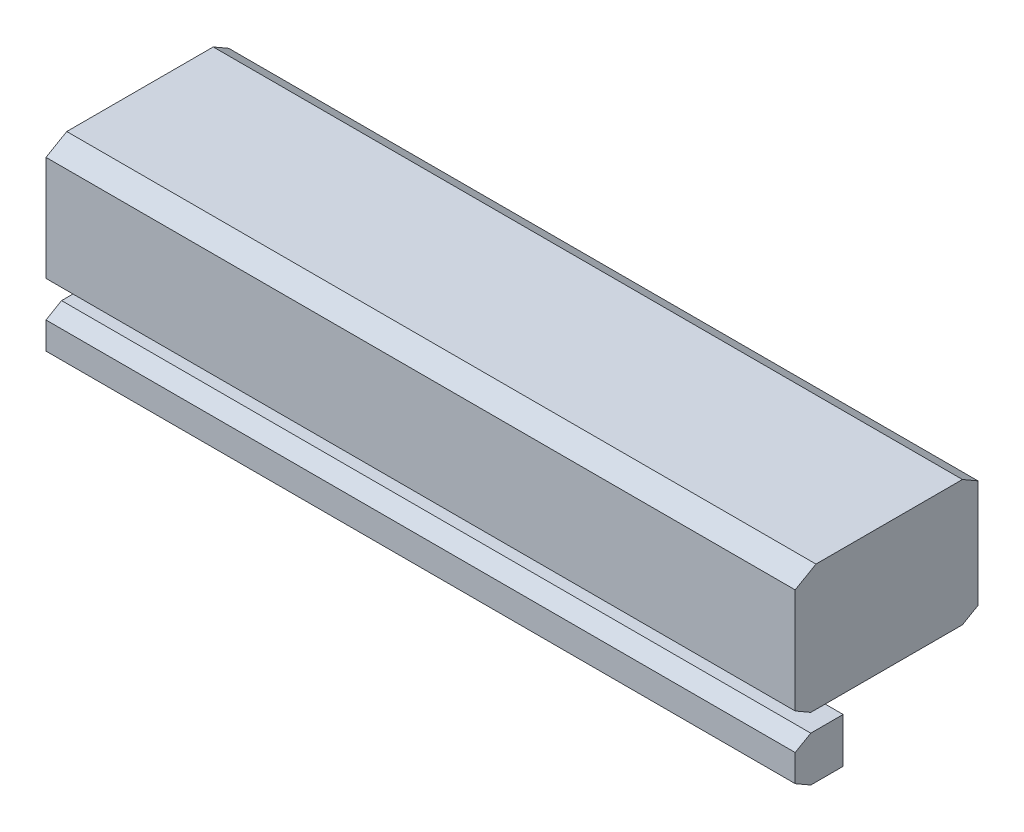
ISO-10303-21;
HEADER;
FILE_DESCRIPTION(('STEP AP214'),'2;1');
FILE_NAME('part.step','',(''),(''),'','','');
FILE_SCHEMA(('AUTOMOTIVE_DESIGN { 1 0 10303 214 1 1 1 1 }'));
ENDSEC;
DATA;
#1=APPLICATION_CONTEXT('core data for automotive mechanical design processes');
#2=APPLICATION_PROTOCOL_DEFINITION('international standard','automotive_design',2000,#1);
#3=PRODUCT_CONTEXT('',#1,'mechanical');
#4=PRODUCT('Part','Part','',(#3));
#5=PRODUCT_RELATED_PRODUCT_CATEGORY('part','',(#4));
#6=PRODUCT_DEFINITION_FORMATION('','',#4);
#7=PRODUCT_DEFINITION_CONTEXT('part definition',#1,'design');
#8=PRODUCT_DEFINITION('design','',#6,#7);
#9=PRODUCT_DEFINITION_SHAPE('','',#8);
#10=(LENGTH_UNIT() NAMED_UNIT(*) SI_UNIT(.MILLI.,.METRE.));
#11=(NAMED_UNIT(*) PLANE_ANGLE_UNIT() SI_UNIT($,.RADIAN.));
#12=(NAMED_UNIT(*) SI_UNIT($,.STERADIAN.) SOLID_ANGLE_UNIT());
#13=UNCERTAINTY_MEASURE_WITH_UNIT(LENGTH_MEASURE(1.E-05),#10,'distance_accuracy_value','');
#14=(GEOMETRIC_REPRESENTATION_CONTEXT(3) GLOBAL_UNCERTAINTY_ASSIGNED_CONTEXT((#13)) GLOBAL_UNIT_ASSIGNED_CONTEXT((#10,
#11,#12)) REPRESENTATION_CONTEXT('',''));
#15=CARTESIAN_POINT('',(0.,0.,0.));
#16=DIRECTION('',(0.,0.,1.));
#17=DIRECTION('',(1.,0.,0.));
#18=AXIS2_PLACEMENT_3D('',#15,#16,#17);
#19=CARTESIAN_POINT('',(55.,-42.,14.3038475772934));
#20=DIRECTION('',(0.,1.,0.));
#21=DIRECTION('',(0.,0.,1.));
#22=AXIS2_PLACEMENT_3D('',#19,#20,#21);
#23=PLANE('',#22);
#24=DIRECTION('',(1.,0.,0.));
#25=VECTOR('',#24,1.);
#26=CARTESIAN_POINT('',(-35.,-42.,-50.6961524227066));
#27=LINE('',#26,#25);
#28=CARTESIAN_POINT('',(-35.,-42.,-50.6961524227066));
#29=VERTEX_POINT('',#28);
#30=CARTESIAN_POINT('',(35.,-42.,-50.6961524227066));
#31=VERTEX_POINT('',#30);
#32=EDGE_CURVE('E668',#29,#31,#27,.T.);
#33=ORIENTED_EDGE('',*,*,#32,.F.);
#34=DIRECTION('',(0.,0.,-1.));
#35=VECTOR('',#34,1.);
#36=CARTESIAN_POINT('',(-35.,-42.,-50.6961524227066));
#37=LINE('',#36,#35);
#38=CARTESIAN_POINT('',(-35.,-42.,-17.6961524227066));
#39=VERTEX_POINT('',#38);
#40=EDGE_CURVE('E64',#39,#29,#37,.T.);
#41=ORIENTED_EDGE('',*,*,#40,.F.);
#42=DIRECTION('',(-1.,0.,0.));
#43=VECTOR('',#42,1.);
#44=CARTESIAN_POINT('',(-35.,-42.,-17.6961524227066));
#45=LINE('',#44,#43);
#46=CARTESIAN_POINT('',(35.,-42.,-17.6961524227066));
#47=VERTEX_POINT('',#46);
#48=EDGE_CURVE('E227',#47,#39,#45,.T.);
#49=ORIENTED_EDGE('',*,*,#48,.F.);
#50=DIRECTION('',(0.,0.,1.));
#51=VECTOR('',#50,1.);
#52=CARTESIAN_POINT('',(35.,-42.,-50.6961524227066));
#53=LINE('',#52,#51);
#54=EDGE_CURVE('E664',#31,#47,#53,.T.);
#55=ORIENTED_EDGE('',*,*,#54,.F.);
#56=EDGE_LOOP('',(#33,#41,#49,#55));
#57=FACE_BOUND('',#56,.T.);
#58=DIRECTION('',(0.,0.,-1.));
#59=VECTOR('',#58,1.);
#60=CARTESIAN_POINT('',(125.,-42.,30.5));
#61=LINE('',#60,#59);
#62=CARTESIAN_POINT('',(125.,-42.,25.3038475772934));
#63=VERTEX_POINT('',#62);
#64=CARTESIAN_POINT('',(125.,-42.,14.5));
#65=VERTEX_POINT('',#64);
#66=EDGE_CURVE('E257',#63,#65,#61,.T.);
#67=ORIENTED_EDGE('',*,*,#66,.F.);
#68=DIRECTION('',(-1.,0.,0.));
#69=VECTOR('',#68,1.);
#70=CARTESIAN_POINT('',(55.,-42.,25.3038475772934));
#71=LINE('',#70,#69);
#72=CARTESIAN_POINT('',(-125.,-42.,25.3038475772934));
#73=VERTEX_POINT('',#72);
#74=EDGE_CURVE('E453',#63,#73,#71,.T.);
#75=ORIENTED_EDGE('',*,*,#74,.T.);
#76=DIRECTION('',(0.,0.,-1.));
#77=VECTOR('',#76,1.);
#78=CARTESIAN_POINT('',(-125.,-42.,30.5));
#79=LINE('',#78,#77);
#80=CARTESIAN_POINT('',(-125.,-42.,14.5));
#81=VERTEX_POINT('',#80);
#82=EDGE_CURVE('E272',#73,#81,#79,.T.);
#83=ORIENTED_EDGE('',*,*,#82,.T.);
#84=DIRECTION('',(-1.,0.,0.));
#85=VECTOR('',#84,1.);
#86=CARTESIAN_POINT('',(125.,-42.,14.5));
#87=LINE('',#86,#85);
#88=CARTESIAN_POINT('',(-55.,-42.,14.5));
#89=VERTEX_POINT('',#88);
#90=EDGE_CURVE('E286',#89,#81,#87,.T.);
#91=ORIENTED_EDGE('',*,*,#90,.F.);
#92=DIRECTION('',(0.,0.,-1.));
#93=VECTOR('',#92,1.);
#94=CARTESIAN_POINT('',(-55.,-42.,14.3038475772934));
#95=LINE('',#94,#93);
#96=CARTESIAN_POINT('',(-55.,-42.,-60.6961524227066));
#97=VERTEX_POINT('',#96);
#98=EDGE_CURVE('E328',#89,#97,#95,.T.);
#99=ORIENTED_EDGE('',*,*,#98,.T.);
#100=DIRECTION('',(-1.,0.,0.));
#101=VECTOR('',#100,1.);
#102=CARTESIAN_POINT('',(55.,-42.,-60.6961524227066));
#103=LINE('',#102,#101);
#104=CARTESIAN_POINT('',(55.,-42.,-60.6961524227066));
#105=VERTEX_POINT('',#104);
#106=EDGE_CURVE('E357',#105,#97,#103,.T.);
#107=ORIENTED_EDGE('',*,*,#106,.F.);
#108=DIRECTION('',(0.,0.,-1.));
#109=VECTOR('',#108,1.);
#110=CARTESIAN_POINT('',(55.,-42.,20.3038475772934));
#111=LINE('',#110,#109);
#112=CARTESIAN_POINT('',(55.,-42.,14.5));
#113=VERTEX_POINT('',#112);
#114=EDGE_CURVE('E306',#113,#105,#111,.T.);
#115=ORIENTED_EDGE('',*,*,#114,.F.);
#116=EDGE_CURVE('E287',#65,#113,#87,.T.);
#117=ORIENTED_EDGE('',*,*,#116,.F.);
#118=EDGE_LOOP('',(#67,#75,#83,#91,#99,#107,#115,#117));
#119=FACE_BOUND('',#118,.T.);
#120=CARTESIAN_POINT('',(0.,-42.,-1.5));
#121=DIRECTION('',(0.,-1.,0.));
#122=DIRECTION('',(0.,0.,-1.));
#123=AXIS2_PLACEMENT_3D('',#120,#121,#122);
#124=CIRCLE('',#123,2.525);
#125=CARTESIAN_POINT('',(0.,-42.,-4.025));
#126=VERTEX_POINT('',#125);
#127=EDGE_CURVE('E646',#126,#126,#124,.T.);
#128=ORIENTED_EDGE('',*,*,#127,.F.);
#129=EDGE_LOOP('',(#128));
#130=FACE_BOUND('',#129,.T.);
#131=ADVANCED_FACE('F47',(#57,#119,#130),#23,.F.);
#132=CARTESIAN_POINT('',(55.,-21.,20.3038475772934));
#133=DIRECTION('',(0.,0.,-1.));
#134=DIRECTION('',(-1.,0.,0.));
#135=AXIS2_PLACEMENT_3D('',#132,#133,#134);
#136=PLANE('',#135);
#137=DIRECTION('',(-1.,0.,0.));
#138=VECTOR('',#137,1.);
#139=CARTESIAN_POINT('',(55.,-27.,20.3038475772934));
#140=LINE('',#139,#138);
#141=CARTESIAN_POINT('',(55.,-27.,20.3038475772934));
#142=VERTEX_POINT('',#141);
#143=CARTESIAN_POINT('',(-55.,-27.,20.3038475772934));
#144=VERTEX_POINT('',#143);
#145=EDGE_CURVE('E291',#142,#144,#140,.T.);
#146=ORIENTED_EDGE('',*,*,#145,.F.);
#147=DIRECTION('',(0.,-1.,0.));
#148=VECTOR('',#147,1.);
#149=CARTESIAN_POINT('',(55.,-21.,20.3038475772934));
#150=LINE('',#149,#148);
#151=CARTESIAN_POINT('',(55.,-21.,20.3038475772934));
#152=VERTEX_POINT('',#151);
#153=EDGE_CURVE('E302',#152,#142,#150,.T.);
#154=ORIENTED_EDGE('',*,*,#153,.F.);
#155=DIRECTION('',(-1.,0.,0.));
#156=VECTOR('',#155,1.);
#157=CARTESIAN_POINT('',(55.,-21.,20.3038475772934));
#158=LINE('',#157,#156);
#159=CARTESIAN_POINT('',(-55.,-21.,20.3038475772934));
#160=VERTEX_POINT('',#159);
#161=EDGE_CURVE('E324',#152,#160,#158,.T.);
#162=ORIENTED_EDGE('',*,*,#161,.T.);
#163=DIRECTION('',(0.,-1.,0.));
#164=VECTOR('',#163,1.);
#165=CARTESIAN_POINT('',(-55.,-21.,20.3038475772934));
#166=LINE('',#165,#164);
#167=EDGE_CURVE('E301',#160,#144,#166,.T.);
#168=ORIENTED_EDGE('',*,*,#167,.T.);
#169=EDGE_LOOP('',(#146,#154,#162,#168));
#170=FACE_BOUND('',#169,.T.);
#171=ADVANCED_FACE('F535',(#170),#136,.F.);
#172=CARTESIAN_POINT('',(55.,0.,0.));
#173=DIRECTION('',(1.,0.,0.));
#174=DIRECTION('',(0.,0.,-1.));
#175=AXIS2_PLACEMENT_3D('',#172,#173,#174);
#176=PLANE('',#175);
#177=DIRECTION('',(0.,0.,-1.));
#178=VECTOR('',#177,1.);
#179=CARTESIAN_POINT('',(55.,-27.,0.));
#180=LINE('',#179,#178);
#181=CARTESIAN_POINT('',(55.,-27.,14.5));
#182=VERTEX_POINT('',#181);
#183=EDGE_CURVE('E295',#142,#182,#180,.T.);
#184=ORIENTED_EDGE('',*,*,#183,.T.);
#185=DIRECTION('',(0.,-1.,0.));
#186=VECTOR('',#185,1.);
#187=CARTESIAN_POINT('',(55.,0.,14.5));
#188=LINE('',#187,#186);
#189=EDGE_CURVE('E298',#182,#113,#188,.T.);
#190=ORIENTED_EDGE('',*,*,#189,.T.);
#191=ORIENTED_EDGE('',*,*,#114,.T.);
#192=DIRECTION('',(0.,1.,0.));
#193=VECTOR('',#192,1.);
#194=CARTESIAN_POINT('',(55.,-42.,-60.6961524227066));
#195=LINE('',#194,#193);
#196=CARTESIAN_POINT('',(55.,-36.,-60.6961524227066));
#197=VERTEX_POINT('',#196);
#198=EDGE_CURVE('E310',#105,#197,#195,.T.);
#199=ORIENTED_EDGE('',*,*,#198,.T.);
#200=DIRECTION('',(0.,0.,1.));
#201=VECTOR('',#200,1.);
#202=CARTESIAN_POINT('',(55.,-36.,14.3038475772934));
#203=LINE('',#202,#201);
#204=CARTESIAN_POINT('',(55.,-36.,14.3038475772934));
#205=VERTEX_POINT('',#204);
#206=EDGE_CURVE('E313',#197,#205,#203,.T.);
#207=ORIENTED_EDGE('',*,*,#206,.T.);
#208=DIRECTION('',(0.,1.,0.));
#209=VECTOR('',#208,1.);
#210=CARTESIAN_POINT('',(55.,-21.,14.3038475772934));
#211=LINE('',#210,#209);
#212=CARTESIAN_POINT('',(55.,-21.,14.3038475772934));
#213=VERTEX_POINT('',#212);
#214=EDGE_CURVE('E316',#205,#213,#211,.T.);
#215=ORIENTED_EDGE('',*,*,#214,.T.);
#216=DIRECTION('',(0.,0.,1.));
#217=VECTOR('',#216,1.);
#218=CARTESIAN_POINT('',(55.,-21.,20.3038475772934));
#219=LINE('',#218,#217);
#220=EDGE_CURVE('E320',#213,#152,#219,.T.);
#221=ORIENTED_EDGE('',*,*,#220,.T.);
#222=ORIENTED_EDGE('',*,*,#153,.T.);
#223=EDGE_LOOP('',(#184,#190,#191,#199,#207,#215,#221,#222));
#224=FACE_BOUND('',#223,.T.);
#225=ADVANCED_FACE('F527',(#224),#176,.T.);
#226=CARTESIAN_POINT('',(-55.,0.,0.));
#227=DIRECTION('',(1.,0.,0.));
#228=DIRECTION('',(0.,0.,-1.));
#229=AXIS2_PLACEMENT_3D('',#226,#227,#228);
#230=PLANE('',#229);
#231=DIRECTION('',(0.,-1.,0.));
#232=VECTOR('',#231,1.);
#233=CARTESIAN_POINT('',(-55.,0.,14.5));
#234=LINE('',#233,#232);
#235=CARTESIAN_POINT('',(-55.,-27.,14.5));
#236=VERTEX_POINT('',#235);
#237=EDGE_CURVE('E449',#236,#89,#234,.T.);
#238=ORIENTED_EDGE('',*,*,#237,.F.);
#239=DIRECTION('',(0.,0.,-1.));
#240=VECTOR('',#239,1.);
#241=CARTESIAN_POINT('',(-55.,-27.,0.));
#242=LINE('',#241,#240);
#243=EDGE_CURVE('E445',#144,#236,#242,.T.);
#244=ORIENTED_EDGE('',*,*,#243,.F.);
#245=ORIENTED_EDGE('',*,*,#167,.F.);
#246=DIRECTION('',(0.,0.,1.));
#247=VECTOR('',#246,1.);
#248=CARTESIAN_POINT('',(-55.,-21.,20.3038475772934));
#249=LINE('',#248,#247);
#250=CARTESIAN_POINT('',(-55.,-21.,14.3038475772934));
#251=VERTEX_POINT('',#250);
#252=EDGE_CURVE('E307',#251,#160,#249,.T.);
#253=ORIENTED_EDGE('',*,*,#252,.F.);
#254=DIRECTION('',(0.,1.,0.));
#255=VECTOR('',#254,1.);
#256=CARTESIAN_POINT('',(-55.,-21.,14.3038475772934));
#257=LINE('',#256,#255);
#258=CARTESIAN_POINT('',(-55.,-36.,14.3038475772934));
#259=VERTEX_POINT('',#258);
#260=EDGE_CURVE('E337',#259,#251,#257,.T.);
#261=ORIENTED_EDGE('',*,*,#260,.F.);
#262=DIRECTION('',(0.,0.,1.));
#263=VECTOR('',#262,1.);
#264=CARTESIAN_POINT('',(-55.,-36.,14.3038475772934));
#265=LINE('',#264,#263);
#266=CARTESIAN_POINT('',(-55.,-36.,-60.6961524227066));
#267=VERTEX_POINT('',#266);
#268=EDGE_CURVE('E334',#267,#259,#265,.T.);
#269=ORIENTED_EDGE('',*,*,#268,.F.);
#270=DIRECTION('',(0.,1.,0.));
#271=VECTOR('',#270,1.);
#272=CARTESIAN_POINT('',(-55.,-42.,-60.6961524227066));
#273=LINE('',#272,#271);
#274=EDGE_CURVE('E331',#97,#267,#273,.T.);
#275=ORIENTED_EDGE('',*,*,#274,.F.);
#276=ORIENTED_EDGE('',*,*,#98,.F.);
#277=EDGE_LOOP('',(#238,#244,#245,#253,#261,#269,#275,#276));
#278=FACE_BOUND('',#277,.T.);
#279=ADVANCED_FACE('F517',(#278),#230,.F.);
#280=CARTESIAN_POINT('',(125.,-21.,30.5));
#281=DIRECTION('',(0.,0.,-1.));
#282=DIRECTION('',(0.,1.,0.));
#283=AXIS2_PLACEMENT_3D('',#280,#281,#282);
#284=PLANE('',#283);
#285=DIRECTION('',(0.,-1.,0.));
#286=VECTOR('',#285,1.);
#287=CARTESIAN_POINT('',(-125.,-21.,30.5));
#288=LINE('',#287,#286);
#289=CARTESIAN_POINT('',(-125.,17.,30.5));
#290=VERTEX_POINT('',#289);
#291=CARTESIAN_POINT('',(-125.,-18.,30.5));
#292=VERTEX_POINT('',#291);
#293=EDGE_CURVE('E361',#290,#292,#288,.T.);
#294=ORIENTED_EDGE('',*,*,#293,.T.);
#295=DIRECTION('',(1.,0.,0.));
#296=VECTOR('',#295,1.);
#297=CARTESIAN_POINT('',(125.,-18.,30.5));
#298=LINE('',#297,#296);
#299=CARTESIAN_POINT('',(125.,-18.,30.5));
#300=VERTEX_POINT('',#299);
#301=EDGE_CURVE('E442',#292,#300,#298,.T.);
#302=ORIENTED_EDGE('',*,*,#301,.T.);
#303=DIRECTION('',(0.,-1.,0.));
#304=VECTOR('',#303,1.);
#305=CARTESIAN_POINT('',(125.,-21.,30.5));
#306=LINE('',#305,#304);
#307=CARTESIAN_POINT('',(125.,17.,30.5));
#308=VERTEX_POINT('',#307);
#309=EDGE_CURVE('E362',#308,#300,#306,.T.);
#310=ORIENTED_EDGE('',*,*,#309,.F.);
#311=DIRECTION('',(-1.,0.,0.));
#312=VECTOR('',#311,1.);
#313=CARTESIAN_POINT('',(125.,17.,30.5));
#314=LINE('',#313,#312);
#315=EDGE_CURVE('E378',#308,#290,#314,.T.);
#316=ORIENTED_EDGE('',*,*,#315,.T.);
#317=EDGE_LOOP('',(#294,#302,#310,#316));
#318=FACE_BOUND('',#317,.T.);
#319=ADVANCED_FACE('F542',(#318),#284,.F.);
#320=CARTESIAN_POINT('',(125.,-21.,30.5));
#321=DIRECTION('',(0.,1.,0.));
#322=DIRECTION('',(0.,0.,1.));
#323=AXIS2_PLACEMENT_3D('',#320,#321,#322);
#324=PLANE('',#323);
#325=ORIENTED_EDGE('',*,*,#161,.F.);
#326=ORIENTED_EDGE('',*,*,#220,.F.);
#327=DIRECTION('',(-1.,0.,0.));
#328=VECTOR('',#327,1.);
#329=CARTESIAN_POINT('',(55.,-21.,14.3038475772934));
#330=LINE('',#329,#328);
#331=EDGE_CURVE('E346',#213,#251,#330,.T.);
#332=ORIENTED_EDGE('',*,*,#331,.T.);
#333=ORIENTED_EDGE('',*,*,#252,.T.);
#334=EDGE_LOOP('',(#325,#326,#332,#333));
#335=FACE_BOUND('',#334,.T.);
#336=DIRECTION('',(0.,0.,-1.));
#337=VECTOR('',#336,1.);
#338=CARTESIAN_POINT('',(-125.,-21.,30.5));
#339=LINE('',#338,#337);
#340=CARTESIAN_POINT('',(-125.,-21.,25.3038475772934));
#341=VERTEX_POINT('',#340);
#342=CARTESIAN_POINT('',(-125.,-21.,-25.3038475772934));
#343=VERTEX_POINT('',#342);
#344=EDGE_CURVE('E382',#341,#343,#339,.T.);
#345=ORIENTED_EDGE('',*,*,#344,.T.);
#346=DIRECTION('',(1.,0.,0.));
#347=VECTOR('',#346,1.);
#348=CARTESIAN_POINT('',(125.,-21.,-25.3038475772934));
#349=LINE('',#348,#347);
#350=CARTESIAN_POINT('',(125.,-21.,-25.3038475772934));
#351=VERTEX_POINT('',#350);
#352=EDGE_CURVE('E439',#343,#351,#349,.T.);
#353=ORIENTED_EDGE('',*,*,#352,.T.);
#354=DIRECTION('',(0.,0.,-1.));
#355=VECTOR('',#354,1.);
#356=CARTESIAN_POINT('',(125.,-21.,30.5));
#357=LINE('',#356,#355);
#358=CARTESIAN_POINT('',(125.,-21.,25.3038475772934));
#359=VERTEX_POINT('',#358);
#360=EDGE_CURVE('E366',#359,#351,#357,.T.);
#361=ORIENTED_EDGE('',*,*,#360,.F.);
#362=DIRECTION('',(-1.,0.,0.));
#363=VECTOR('',#362,1.);
#364=CARTESIAN_POINT('',(125.,-21.,25.3038475772934));
#365=LINE('',#364,#363);
#366=EDGE_CURVE('E435',#359,#341,#365,.T.);
#367=ORIENTED_EDGE('',*,*,#366,.T.);
#368=EDGE_LOOP('',(#345,#353,#361,#367));
#369=FACE_BOUND('',#368,.T.);
#370=ADVANCED_FACE('F538',(#335,#369),#324,.F.);
#371=CARTESIAN_POINT('',(125.,-21.,-30.5));
#372=DIRECTION('',(0.,0.,1.));
#373=DIRECTION('',(0.,-1.,0.));
#374=AXIS2_PLACEMENT_3D('',#371,#372,#373);
#375=PLANE('',#374);
#376=DIRECTION('',(0.,1.,0.));
#377=VECTOR('',#376,1.);
#378=CARTESIAN_POINT('',(-125.,-21.,-30.5));
#379=LINE('',#378,#377);
#380=CARTESIAN_POINT('',(-125.,-18.,-30.5));
#381=VERTEX_POINT('',#380);
#382=CARTESIAN_POINT('',(-125.,18.,-30.5));
#383=VERTEX_POINT('',#382);
#384=EDGE_CURVE('E386',#381,#383,#379,.T.);
#385=ORIENTED_EDGE('',*,*,#384,.T.);
#386=DIRECTION('',(1.,0.,0.));
#387=VECTOR('',#386,1.);
#388=CARTESIAN_POINT('',(125.,18.,-30.5));
#389=LINE('',#388,#387);
#390=CARTESIAN_POINT('',(125.,18.,-30.5));
#391=VERTEX_POINT('',#390);
#392=EDGE_CURVE('E423',#383,#391,#389,.T.);
#393=ORIENTED_EDGE('',*,*,#392,.T.);
#394=DIRECTION('',(0.,1.,0.));
#395=VECTOR('',#394,1.);
#396=CARTESIAN_POINT('',(125.,-21.,-30.5));
#397=LINE('',#396,#395);
#398=CARTESIAN_POINT('',(125.,-18.,-30.5));
#399=VERTEX_POINT('',#398);
#400=EDGE_CURVE('E371',#399,#391,#397,.T.);
#401=ORIENTED_EDGE('',*,*,#400,.F.);
#402=DIRECTION('',(-1.,0.,0.));
#403=VECTOR('',#402,1.);
#404=CARTESIAN_POINT('',(125.,-18.,-30.5));
#405=LINE('',#404,#403);
#406=EDGE_CURVE('E419',#399,#381,#405,.T.);
#407=ORIENTED_EDGE('',*,*,#406,.T.);
#408=EDGE_LOOP('',(#385,#393,#401,#407));
#409=FACE_BOUND('',#408,.T.);
#410=ADVANCED_FACE('F541',(#409),#375,.F.);
#411=CARTESIAN_POINT('',(125.,21.,30.5));
#412=DIRECTION('',(0.,-1.,0.));
#413=DIRECTION('',(0.,0.,-1.));
#414=AXIS2_PLACEMENT_3D('',#411,#412,#413);
#415=PLANE('',#414);
#416=DIRECTION('',(0.,0.,1.));
#417=VECTOR('',#416,1.);
#418=CARTESIAN_POINT('',(125.,21.,30.5));
#419=LINE('',#418,#417);
#420=CARTESIAN_POINT('',(125.,21.,-25.3038475772934));
#421=VERTEX_POINT('',#420);
#422=CARTESIAN_POINT('',(125.,21.,23.5717967697245));
#423=VERTEX_POINT('',#422);
#424=EDGE_CURVE('E375',#421,#423,#419,.T.);
#425=ORIENTED_EDGE('',*,*,#424,.F.);
#426=DIRECTION('',(-1.,0.,0.));
#427=VECTOR('',#426,1.);
#428=CARTESIAN_POINT('',(125.,21.,-25.3038475772934));
#429=LINE('',#428,#427);
#430=CARTESIAN_POINT('',(-125.,21.,-25.3038475772934));
#431=VERTEX_POINT('',#430);
#432=EDGE_CURVE('E406',#421,#431,#429,.T.);
#433=ORIENTED_EDGE('',*,*,#432,.T.);
#434=DIRECTION('',(0.,0.,1.));
#435=VECTOR('',#434,1.);
#436=CARTESIAN_POINT('',(-125.,21.,30.5));
#437=LINE('',#436,#435);
#438=CARTESIAN_POINT('',(-125.,21.,23.5717967697245));
#439=VERTEX_POINT('',#438);
#440=EDGE_CURVE('E367',#431,#439,#437,.T.);
#441=ORIENTED_EDGE('',*,*,#440,.T.);
#442=DIRECTION('',(1.,0.,0.));
#443=VECTOR('',#442,1.);
#444=CARTESIAN_POINT('',(125.,21.,23.5717967697245));
#445=LINE('',#444,#443);
#446=EDGE_CURVE('E399',#439,#423,#445,.T.);
#447=ORIENTED_EDGE('',*,*,#446,.T.);
#448=EDGE_LOOP('',(#425,#433,#441,#447));
#449=FACE_BOUND('',#448,.T.);
#450=ADVANCED_FACE('F565',(#449),#415,.F.);
#451=CARTESIAN_POINT('',(125.,0.,0.));
#452=DIRECTION('',(-1.,0.,0.));
#453=DIRECTION('',(0.,0.,1.));
#454=AXIS2_PLACEMENT_3D('',#451,#452,#453);
#455=PLANE('',#454);
#456=ORIENTED_EDGE('',*,*,#400,.T.);
#457=DIRECTION('',(0.,-0.500000000000005,-0.866025403784436));
#458=VECTOR('',#457,1.);
#459=CARTESIAN_POINT('',(125.,21.,-25.3038475772934));
#460=LINE('',#459,#458);
#461=EDGE_CURVE('E432',#391,#421,#460,.F.);
#462=ORIENTED_EDGE('',*,*,#461,.T.);
#463=ORIENTED_EDGE('',*,*,#424,.T.);
#464=DIRECTION('',(0.,0.500000000000003,-0.866025403784437));
#465=VECTOR('',#464,1.);
#466=CARTESIAN_POINT('',(125.,17.,30.5));
#467=LINE('',#466,#465);
#468=EDGE_CURVE('E403',#423,#308,#467,.F.);
#469=ORIENTED_EDGE('',*,*,#468,.T.);
#470=ORIENTED_EDGE('',*,*,#309,.T.);
#471=DIRECTION('',(0.,0.500000000000005,0.866025403784436));
#472=VECTOR('',#471,1.);
#473=CARTESIAN_POINT('',(125.,-21.,25.3038475772934));
#474=LINE('',#473,#472);
#475=EDGE_CURVE('E426',#300,#359,#474,.F.);
#476=ORIENTED_EDGE('',*,*,#475,.T.);
#477=ORIENTED_EDGE('',*,*,#360,.T.);
#478=DIRECTION('',(0.,-0.500000000000005,0.866025403784436));
#479=VECTOR('',#478,1.);
#480=CARTESIAN_POINT('',(125.,-18.,-30.5));
#481=LINE('',#480,#479);
#482=EDGE_CURVE('E429',#351,#399,#481,.F.);
#483=ORIENTED_EDGE('',*,*,#482,.T.);
#484=EDGE_LOOP('',(#456,#462,#463,#469,#470,#476,#477,#483));
#485=FACE_BOUND('',#484,.T.);
#486=ADVANCED_FACE('F555',(#485),#455,.F.);
#487=CARTESIAN_POINT('',(-125.,0.,0.));
#488=DIRECTION('',(-1.,0.,0.));
#489=DIRECTION('',(0.,0.,1.));
#490=AXIS2_PLACEMENT_3D('',#487,#488,#489);
#491=PLANE('',#490);
#492=ORIENTED_EDGE('',*,*,#440,.F.);
#493=DIRECTION('',(0.,0.500000000000005,0.866025403784436));
#494=VECTOR('',#493,1.);
#495=CARTESIAN_POINT('',(-125.,26.7068874077127,-15.4192286340601));
#496=LINE('',#495,#494);
#497=EDGE_CURVE('E416',#431,#383,#496,.F.);
#498=ORIENTED_EDGE('',*,*,#497,.T.);
#499=ORIENTED_EDGE('',*,*,#384,.F.);
#500=DIRECTION('',(0.,0.500000000000005,-0.866025403784436));
#501=VECTOR('',#500,1.);
#502=CARTESIAN_POINT('',(-125.,-26.7068874077127,-15.4192286340601));
#503=LINE('',#502,#501);
#504=EDGE_CURVE('E413',#381,#343,#503,.F.);
#505=ORIENTED_EDGE('',*,*,#504,.T.);
#506=ORIENTED_EDGE('',*,*,#344,.F.);
#507=DIRECTION('',(0.,-0.500000000000005,-0.866025403784436));
#508=VECTOR('',#507,1.);
#509=CARTESIAN_POINT('',(-125.,-26.7068874077127,15.4192286340601));
#510=LINE('',#509,#508);
#511=EDGE_CURVE('E410',#341,#292,#510,.F.);
#512=ORIENTED_EDGE('',*,*,#511,.T.);
#513=ORIENTED_EDGE('',*,*,#293,.F.);
#514=DIRECTION('',(0.,-0.500000000000003,0.866025403784437));
#515=VECTOR('',#514,1.);
#516=CARTESIAN_POINT('',(-125.,25.9568874077127,14.9862159321679));
#517=LINE('',#516,#515);
#518=EDGE_CURVE('E395',#290,#439,#517,.F.);
#519=ORIENTED_EDGE('',*,*,#518,.T.);
#520=EDGE_LOOP('',(#492,#498,#499,#505,#506,#512,#513,#519));
#521=FACE_BOUND('',#520,.T.);
#522=ADVANCED_FACE('F579',(#521),#491,.T.);
#523=CARTESIAN_POINT('',(125.,17.,30.5));
#524=DIRECTION('',(0.,-0.866025403784437,-0.500000000000003));
#525=DIRECTION('',(-1.,0.,0.));
#526=AXIS2_PLACEMENT_3D('',#523,#524,#525);
#527=PLANE('',#526);
#528=ORIENTED_EDGE('',*,*,#468,.F.);
#529=ORIENTED_EDGE('',*,*,#446,.F.);
#530=ORIENTED_EDGE('',*,*,#518,.F.);
#531=ORIENTED_EDGE('',*,*,#315,.F.);
#532=EDGE_LOOP('',(#528,#529,#530,#531));
#533=FACE_BOUND('',#532,.T.);
#534=ADVANCED_FACE('F571',(#533),#527,.F.);
#535=CARTESIAN_POINT('',(125.,21.,-25.3038475772934));
#536=DIRECTION('',(0.,-0.866025403784436,0.500000000000005));
#537=DIRECTION('',(-1.,0.,0.));
#538=AXIS2_PLACEMENT_3D('',#535,#536,#537);
#539=PLANE('',#538);
#540=ORIENTED_EDGE('',*,*,#461,.F.);
#541=ORIENTED_EDGE('',*,*,#392,.F.);
#542=ORIENTED_EDGE('',*,*,#497,.F.);
#543=ORIENTED_EDGE('',*,*,#432,.F.);
#544=EDGE_LOOP('',(#540,#541,#542,#543));
#545=FACE_BOUND('',#544,.T.);
#546=ADVANCED_FACE('F561',(#545),#539,.F.);
#547=CARTESIAN_POINT('',(125.,-18.,-30.5));
#548=DIRECTION('',(0.,0.866025403784436,0.500000000000005));
#549=DIRECTION('',(-1.,0.,0.));
#550=AXIS2_PLACEMENT_3D('',#547,#548,#549);
#551=PLANE('',#550);
#552=ORIENTED_EDGE('',*,*,#482,.F.);
#553=ORIENTED_EDGE('',*,*,#352,.F.);
#554=ORIENTED_EDGE('',*,*,#504,.F.);
#555=ORIENTED_EDGE('',*,*,#406,.F.);
#556=EDGE_LOOP('',(#552,#553,#554,#555));
#557=FACE_BOUND('',#556,.T.);
#558=ADVANCED_FACE('F551',(#557),#551,.F.);
#559=CARTESIAN_POINT('',(125.,-21.,25.3038475772934));
#560=DIRECTION('',(0.,0.866025403784436,-0.500000000000005));
#561=DIRECTION('',(-1.,0.,0.));
#562=AXIS2_PLACEMENT_3D('',#559,#560,#561);
#563=PLANE('',#562);
#564=ORIENTED_EDGE('',*,*,#475,.F.);
#565=ORIENTED_EDGE('',*,*,#301,.F.);
#566=ORIENTED_EDGE('',*,*,#511,.F.);
#567=ORIENTED_EDGE('',*,*,#366,.F.);
#568=EDGE_LOOP('',(#564,#565,#566,#567));
#569=FACE_BOUND('',#568,.T.);
#570=ADVANCED_FACE('F578',(#569),#563,.F.);
#571=CARTESIAN_POINT('',(55.,-42.,-60.6961524227066));
#572=DIRECTION('',(0.,0.,1.));
#573=DIRECTION('',(1.,0.,0.));
#574=AXIS2_PLACEMENT_3D('',#571,#572,#573);
#575=PLANE('',#574);
#576=ORIENTED_EDGE('',*,*,#274,.T.);
#577=DIRECTION('',(-1.,0.,0.));
#578=VECTOR('',#577,1.);
#579=CARTESIAN_POINT('',(55.,-36.,-60.6961524227066));
#580=LINE('',#579,#578);
#581=EDGE_CURVE('E353',#197,#267,#580,.T.);
#582=ORIENTED_EDGE('',*,*,#581,.F.);
#583=ORIENTED_EDGE('',*,*,#198,.F.);
#584=ORIENTED_EDGE('',*,*,#106,.T.);
#585=EDGE_LOOP('',(#576,#582,#583,#584));
#586=FACE_BOUND('',#585,.T.);
#587=ADVANCED_FACE('F514',(#586),#575,.F.);
#588=CARTESIAN_POINT('',(55.,-36.,14.3038475772934));
#589=DIRECTION('',(0.,-1.,0.));
#590=DIRECTION('',(0.,0.,-1.));
#591=AXIS2_PLACEMENT_3D('',#588,#589,#590);
#592=PLANE('',#591);
#593=CARTESIAN_POINT('',(0.,-36.,-1.5));
#594=DIRECTION('',(0.,-1.,0.));
#595=DIRECTION('',(0.,0.,-1.));
#596=AXIS2_PLACEMENT_3D('',#593,#594,#595);
#597=CIRCLE('',#596,2.1);
#598=CARTESIAN_POINT('',(0.,-36.,-3.6));
#599=VERTEX_POINT('',#598);
#600=EDGE_CURVE('E650',#599,#599,#597,.T.);
#601=ORIENTED_EDGE('',*,*,#600,.T.);
#602=EDGE_LOOP('',(#601));
#603=FACE_BOUND('',#602,.T.);
#604=DIRECTION('',(1.,0.,0.));
#605=VECTOR('',#604,1.);
#606=CARTESIAN_POINT('',(-35.,-36.,-17.6961524227066));
#607=LINE('',#606,#605);
#608=CARTESIAN_POINT('',(-35.,-36.,-17.6961524227066));
#609=VERTEX_POINT('',#608);
#610=CARTESIAN_POINT('',(35.,-36.,-17.6961524227066));
#611=VERTEX_POINT('',#610);
#612=EDGE_CURVE('E225',#609,#611,#607,.T.);
#613=ORIENTED_EDGE('',*,*,#612,.F.);
#614=DIRECTION('',(0.,0.,1.));
#615=VECTOR('',#614,1.);
#616=CARTESIAN_POINT('',(-35.,-36.,-50.6961524227066));
#617=LINE('',#616,#615);
#618=CARTESIAN_POINT('',(-35.,-36.,-50.6961524227066));
#619=VERTEX_POINT('',#618);
#620=EDGE_CURVE('E233',#619,#609,#617,.T.);
#621=ORIENTED_EDGE('',*,*,#620,.F.);
#622=DIRECTION('',(-1.,0.,0.));
#623=VECTOR('',#622,1.);
#624=CARTESIAN_POINT('',(-35.,-36.,-50.6961524227066));
#625=LINE('',#624,#623);
#626=CARTESIAN_POINT('',(35.,-36.,-50.6961524227066));
#627=VERTEX_POINT('',#626);
#628=EDGE_CURVE('E239',#627,#619,#625,.T.);
#629=ORIENTED_EDGE('',*,*,#628,.F.);
#630=DIRECTION('',(0.,0.,-1.));
#631=VECTOR('',#630,1.);
#632=CARTESIAN_POINT('',(35.,-36.,-50.6961524227066));
#633=LINE('',#632,#631);
#634=EDGE_CURVE('E72',#611,#627,#633,.T.);
#635=ORIENTED_EDGE('',*,*,#634,.F.);
#636=EDGE_LOOP('',(#613,#621,#629,#635));
#637=FACE_BOUND('',#636,.T.);
#638=ORIENTED_EDGE('',*,*,#268,.T.);
#639=DIRECTION('',(-1.,0.,0.));
#640=VECTOR('',#639,1.);
#641=CARTESIAN_POINT('',(55.,-36.,14.3038475772934));
#642=LINE('',#641,#640);
#643=EDGE_CURVE('E349',#205,#259,#642,.T.);
#644=ORIENTED_EDGE('',*,*,#643,.F.);
#645=ORIENTED_EDGE('',*,*,#206,.F.);
#646=ORIENTED_EDGE('',*,*,#581,.T.);
#647=EDGE_LOOP('',(#638,#644,#645,#646));
#648=FACE_BOUND('',#647,.T.);
#649=ADVANCED_FACE('F241',(#603,#637,#648),#592,.F.);
#650=CARTESIAN_POINT('',(55.,-21.,14.3038475772934));
#651=DIRECTION('',(0.,0.,1.));
#652=DIRECTION('',(0.,-1.,0.));
#653=AXIS2_PLACEMENT_3D('',#650,#651,#652);
#654=PLANE('',#653);
#655=ORIENTED_EDGE('',*,*,#260,.T.);
#656=ORIENTED_EDGE('',*,*,#331,.F.);
#657=ORIENTED_EDGE('',*,*,#214,.F.);
#658=ORIENTED_EDGE('',*,*,#643,.T.);
#659=EDGE_LOOP('',(#655,#656,#657,#658));
#660=FACE_BOUND('',#659,.T.);
#661=ADVANCED_FACE('F524',(#660),#654,.F.);
#662=CARTESIAN_POINT('',(125.,-42.,14.5));
#663=DIRECTION('',(0.,0.,1.));
#664=DIRECTION('',(1.,0.,0.));
#665=AXIS2_PLACEMENT_3D('',#662,#663,#664);
#666=PLANE('',#665);
#667=DIRECTION('',(-1.,0.,0.));
#668=VECTOR('',#667,1.);
#669=CARTESIAN_POINT('',(125.,-27.,14.5));
#670=LINE('',#669,#668);
#671=CARTESIAN_POINT('',(-125.,-27.,14.5));
#672=VERTEX_POINT('',#671);
#673=EDGE_CURVE('E268',#236,#672,#670,.T.);
#674=ORIENTED_EDGE('',*,*,#673,.F.);
#675=ORIENTED_EDGE('',*,*,#237,.T.);
#676=ORIENTED_EDGE('',*,*,#90,.T.);
#677=DIRECTION('',(0.,1.,0.));
#678=VECTOR('',#677,1.);
#679=CARTESIAN_POINT('',(-125.,-42.,14.5));
#680=LINE('',#679,#678);
#681=EDGE_CURVE('E275',#81,#672,#680,.T.);
#682=ORIENTED_EDGE('',*,*,#681,.T.);
#683=EDGE_LOOP('',(#674,#675,#676,#682));
#684=FACE_BOUND('',#683,.T.);
#685=ADVANCED_FACE('F506',(#684),#666,.F.);
#686=CARTESIAN_POINT('',(125.,-42.,30.5));
#687=DIRECTION('',(0.,0.,-1.));
#688=DIRECTION('',(-1.,0.,0.));
#689=AXIS2_PLACEMENT_3D('',#686,#687,#688);
#690=PLANE('',#689);
#691=DIRECTION('',(0.,-1.,0.));
#692=VECTOR('',#691,1.);
#693=CARTESIAN_POINT('',(-125.,-42.,30.5));
#694=LINE('',#693,#692);
#695=CARTESIAN_POINT('',(-125.,-30.,30.5));
#696=VERTEX_POINT('',#695);
#697=CARTESIAN_POINT('',(-125.,-39.,30.5));
#698=VERTEX_POINT('',#697);
#699=EDGE_CURVE('E246',#696,#698,#694,.T.);
#700=ORIENTED_EDGE('',*,*,#699,.T.);
#701=DIRECTION('',(1.,0.,0.));
#702=VECTOR('',#701,1.);
#703=CARTESIAN_POINT('',(125.,-39.,30.5));
#704=LINE('',#703,#702);
#705=CARTESIAN_POINT('',(125.,-39.,30.5));
#706=VERTEX_POINT('',#705);
#707=EDGE_CURVE('E467',#698,#706,#704,.T.);
#708=ORIENTED_EDGE('',*,*,#707,.T.);
#709=DIRECTION('',(0.,-1.,0.));
#710=VECTOR('',#709,1.);
#711=CARTESIAN_POINT('',(125.,-42.,30.5));
#712=LINE('',#711,#710);
#713=CARTESIAN_POINT('',(125.,-30.,30.5));
#714=VERTEX_POINT('',#713);
#715=EDGE_CURVE('E253',#714,#706,#712,.T.);
#716=ORIENTED_EDGE('',*,*,#715,.F.);
#717=DIRECTION('',(-1.,0.,0.));
#718=VECTOR('',#717,1.);
#719=CARTESIAN_POINT('',(125.,-30.,30.5));
#720=LINE('',#719,#718);
#721=EDGE_CURVE('E463',#714,#696,#720,.T.);
#722=ORIENTED_EDGE('',*,*,#721,.T.);
#723=EDGE_LOOP('',(#700,#708,#716,#722));
#724=FACE_BOUND('',#723,.T.);
#725=ADVANCED_FACE('F493',(#724),#690,.F.);
#726=ORIENTED_EDGE('',*,*,#189,.F.);
#727=CARTESIAN_POINT('',(125.,-27.,14.5));
#728=VERTEX_POINT('',#727);
#729=EDGE_CURVE('E282',#728,#182,#670,.T.);
#730=ORIENTED_EDGE('',*,*,#729,.F.);
#731=DIRECTION('',(0.,1.,0.));
#732=VECTOR('',#731,1.);
#733=CARTESIAN_POINT('',(125.,-42.,14.5));
#734=LINE('',#733,#732);
#735=EDGE_CURVE('E261',#65,#728,#734,.T.);
#736=ORIENTED_EDGE('',*,*,#735,.F.);
#737=ORIENTED_EDGE('',*,*,#116,.T.);
#738=EDGE_LOOP('',(#726,#730,#736,#737));
#739=FACE_BOUND('',#738,.T.);
#740=ADVANCED_FACE('F531',(#739),#666,.F.);
#741=CARTESIAN_POINT('',(125.,-27.,30.5));
#742=DIRECTION('',(0.,-1.,0.));
#743=DIRECTION('',(0.,0.,-1.));
#744=AXIS2_PLACEMENT_3D('',#741,#742,#743);
#745=PLANE('',#744);
#746=DIRECTION('',(0.,0.,1.));
#747=VECTOR('',#746,1.);
#748=CARTESIAN_POINT('',(-125.,-27.,30.5));
#749=LINE('',#748,#747);
#750=CARTESIAN_POINT('',(-125.,-27.,25.3038475772934));
#751=VERTEX_POINT('',#750);
#752=EDGE_CURVE('E258',#672,#751,#749,.T.);
#753=ORIENTED_EDGE('',*,*,#752,.T.);
#754=DIRECTION('',(1.,0.,0.));
#755=VECTOR('',#754,1.);
#756=CARTESIAN_POINT('',(125.,-27.,25.3038475772934));
#757=LINE('',#756,#755);
#758=CARTESIAN_POINT('',(125.,-27.,25.3038475772934));
#759=VERTEX_POINT('',#758);
#760=EDGE_CURVE('E11',#751,#759,#757,.T.);
#761=ORIENTED_EDGE('',*,*,#760,.T.);
#762=DIRECTION('',(0.,0.,1.));
#763=VECTOR('',#762,1.);
#764=CARTESIAN_POINT('',(125.,-27.,30.5));
#765=LINE('',#764,#763);
#766=EDGE_CURVE('E264',#728,#759,#765,.T.);
#767=ORIENTED_EDGE('',*,*,#766,.F.);
#768=ORIENTED_EDGE('',*,*,#729,.T.);
#769=ORIENTED_EDGE('',*,*,#183,.F.);
#770=ORIENTED_EDGE('',*,*,#145,.T.);
#771=ORIENTED_EDGE('',*,*,#243,.T.);
#772=ORIENTED_EDGE('',*,*,#673,.T.);
#773=EDGE_LOOP('',(#753,#761,#767,#768,#769,#770,#771,#772));
#774=FACE_BOUND('',#773,.T.);
#775=ADVANCED_FACE('F500',(#774),#745,.F.);
#776=CARTESIAN_POINT('',(125.,0.,0.));
#777=DIRECTION('',(-1.,0.,0.));
#778=DIRECTION('',(0.,0.,1.));
#779=AXIS2_PLACEMENT_3D('',#776,#777,#778);
#780=PLANE('',#779);
#781=ORIENTED_EDGE('',*,*,#715,.T.);
#782=DIRECTION('',(0.,0.500000000000001,0.866025403784438));
#783=VECTOR('',#782,1.);
#784=CARTESIAN_POINT('',(125.,-42.,25.3038475772934));
#785=LINE('',#784,#783);
#786=EDGE_CURVE('E57',#706,#63,#785,.F.);
#787=ORIENTED_EDGE('',*,*,#786,.T.);
#788=ORIENTED_EDGE('',*,*,#66,.T.);
#789=ORIENTED_EDGE('',*,*,#735,.T.);
#790=ORIENTED_EDGE('',*,*,#766,.T.);
#791=DIRECTION('',(0.,0.500000000000001,-0.866025403784438));
#792=VECTOR('',#791,1.);
#793=CARTESIAN_POINT('',(125.,-30.,30.5));
#794=LINE('',#793,#792);
#795=EDGE_CURVE('E470',#759,#714,#794,.F.);
#796=ORIENTED_EDGE('',*,*,#795,.T.);
#797=EDGE_LOOP('',(#781,#787,#788,#789,#790,#796));
#798=FACE_BOUND('',#797,.T.);
#799=ADVANCED_FACE('F476',(#798),#780,.F.);
#800=CARTESIAN_POINT('',(-125.,0.,0.));
#801=DIRECTION('',(-1.,0.,0.));
#802=DIRECTION('',(0.,0.,1.));
#803=AXIS2_PLACEMENT_3D('',#800,#801,#802);
#804=PLANE('',#803);
#805=ORIENTED_EDGE('',*,*,#82,.F.);
#806=DIRECTION('',(0.,-0.500000000000001,-0.866025403784438));
#807=VECTOR('',#806,1.);
#808=CARTESIAN_POINT('',(-125.,-42.4568874077127,24.5124953737966));
#809=LINE('',#808,#807);
#810=EDGE_CURVE('E460',#73,#698,#809,.F.);
#811=ORIENTED_EDGE('',*,*,#810,.T.);
#812=ORIENTED_EDGE('',*,*,#699,.F.);
#813=DIRECTION('',(0.,-0.500000000000001,0.866025403784438));
#814=VECTOR('',#813,1.);
#815=CARTESIAN_POINT('',(-125.,-9.29311259228728,-5.36538105676657));
#816=LINE('',#815,#814);
#817=EDGE_CURVE('E457',#696,#751,#816,.F.);
#818=ORIENTED_EDGE('',*,*,#817,.T.);
#819=ORIENTED_EDGE('',*,*,#752,.F.);
#820=ORIENTED_EDGE('',*,*,#681,.F.);
#821=EDGE_LOOP('',(#805,#811,#812,#818,#819,#820));
#822=FACE_BOUND('',#821,.T.);
#823=ADVANCED_FACE('F490',(#822),#804,.T.);
#824=CARTESIAN_POINT('',(55.,-42.,25.3038475772934));
#825=DIRECTION('',(0.,0.866025403784438,-0.500000000000001));
#826=DIRECTION('',(-1.,0.,0.));
#827=AXIS2_PLACEMENT_3D('',#824,#825,#826);
#828=PLANE('',#827);
#829=ORIENTED_EDGE('',*,*,#786,.F.);
#830=ORIENTED_EDGE('',*,*,#707,.F.);
#831=ORIENTED_EDGE('',*,*,#810,.F.);
#832=ORIENTED_EDGE('',*,*,#74,.F.);
#833=EDGE_LOOP('',(#829,#830,#831,#832));
#834=FACE_BOUND('',#833,.T.);
#835=ADVANCED_FACE('F487',(#834),#828,.F.);
#836=CARTESIAN_POINT('',(125.,-30.,30.5));
#837=DIRECTION('',(0.,-0.866025403784438,-0.500000000000001));
#838=DIRECTION('',(-1.,0.,0.));
#839=AXIS2_PLACEMENT_3D('',#836,#837,#838);
#840=PLANE('',#839);
#841=ORIENTED_EDGE('',*,*,#795,.F.);
#842=ORIENTED_EDGE('',*,*,#760,.F.);
#843=ORIENTED_EDGE('',*,*,#817,.F.);
#844=ORIENTED_EDGE('',*,*,#721,.F.);
#845=EDGE_LOOP('',(#841,#842,#843,#844));
#846=FACE_BOUND('',#845,.T.);
#847=ADVANCED_FACE('F50',(#846),#840,.F.);
#848=CARTESIAN_POINT('',(-35.,21.001,-50.6961524227066));
#849=DIRECTION('',(-1.,0.,0.));
#850=DIRECTION('',(0.,0.,1.));
#851=AXIS2_PLACEMENT_3D('',#848,#849,#850);
#852=PLANE('',#851);
#853=ORIENTED_EDGE('',*,*,#620,.T.);
#854=DIRECTION('',(0.,-1.,0.));
#855=VECTOR('',#854,1.);
#856=CARTESIAN_POINT('',(-35.,21.001,-17.6961524227066));
#857=LINE('',#856,#855);
#858=EDGE_CURVE('E221',#609,#39,#857,.T.);
#859=ORIENTED_EDGE('',*,*,#858,.T.);
#860=ORIENTED_EDGE('',*,*,#40,.T.);
#861=DIRECTION('',(0.,-1.,0.));
#862=VECTOR('',#861,1.);
#863=CARTESIAN_POINT('',(-35.,21.001,-50.6961524227066));
#864=LINE('',#863,#862);
#865=EDGE_CURVE('E230',#619,#29,#864,.T.);
#866=ORIENTED_EDGE('',*,*,#865,.F.);
#867=EDGE_LOOP('',(#853,#859,#860,#866));
#868=FACE_BOUND('',#867,.T.);
#869=ADVANCED_FACE('F234',(#868),#852,.F.);
#870=CARTESIAN_POINT('',(-35.,21.001,-17.6961524227066));
#871=DIRECTION('',(0.,0.,1.));
#872=DIRECTION('',(1.,0.,0.));
#873=AXIS2_PLACEMENT_3D('',#870,#871,#872);
#874=PLANE('',#873);
#875=ORIENTED_EDGE('',*,*,#612,.T.);
#876=DIRECTION('',(0.,-1.,0.));
#877=VECTOR('',#876,1.);
#878=CARTESIAN_POINT('',(35.,21.001,-17.6961524227066));
#879=LINE('',#878,#877);
#880=EDGE_CURVE('E229',#611,#47,#879,.T.);
#881=ORIENTED_EDGE('',*,*,#880,.T.);
#882=ORIENTED_EDGE('',*,*,#48,.T.);
#883=ORIENTED_EDGE('',*,*,#858,.F.);
#884=EDGE_LOOP('',(#875,#881,#882,#883));
#885=FACE_BOUND('',#884,.T.);
#886=ADVANCED_FACE('F223',(#885),#874,.F.);
#887=CARTESIAN_POINT('',(35.,21.001,-50.6961524227066));
#888=DIRECTION('',(1.,0.,0.));
#889=DIRECTION('',(0.,0.,-1.));
#890=AXIS2_PLACEMENT_3D('',#887,#888,#889);
#891=PLANE('',#890);
#892=ORIENTED_EDGE('',*,*,#634,.T.);
#893=DIRECTION('',(0.,-1.,0.));
#894=VECTOR('',#893,1.);
#895=CARTESIAN_POINT('',(35.,21.001,-50.6961524227066));
#896=LINE('',#895,#894);
#897=EDGE_CURVE('E252',#627,#31,#896,.T.);
#898=ORIENTED_EDGE('',*,*,#897,.T.);
#899=ORIENTED_EDGE('',*,*,#54,.T.);
#900=ORIENTED_EDGE('',*,*,#880,.F.);
#901=EDGE_LOOP('',(#892,#898,#899,#900));
#902=FACE_BOUND('',#901,.T.);
#903=ADVANCED_FACE('F624',(#902),#891,.F.);
#904=CARTESIAN_POINT('',(-35.,21.001,-50.6961524227066));
#905=DIRECTION('',(0.,0.,-1.));
#906=DIRECTION('',(-1.,0.,0.));
#907=AXIS2_PLACEMENT_3D('',#904,#905,#906);
#908=PLANE('',#907);
#909=ORIENTED_EDGE('',*,*,#628,.T.);
#910=ORIENTED_EDGE('',*,*,#865,.T.);
#911=ORIENTED_EDGE('',*,*,#32,.T.);
#912=ORIENTED_EDGE('',*,*,#897,.F.);
#913=EDGE_LOOP('',(#909,#910,#911,#912));
#914=FACE_BOUND('',#913,.T.);
#915=ADVANCED_FACE('F627',(#914),#908,.F.);
#916=CARTESIAN_POINT('',(0.,-42.,-1.5));
#917=DIRECTION('',(0.,-1.,0.));
#918=DIRECTION('',(0.,0.,-1.));
#919=AXIS2_PLACEMENT_3D('',#916,#917,#918);
#920=CYLINDRICAL_SURFACE('',#919,2.1);
#921=ORIENTED_EDGE('',*,*,#600,.F.);
#922=EDGE_LOOP('',(#921));
#923=FACE_BOUND('',#922,.T.);
#924=CARTESIAN_POINT('',(0.,-41.575,-1.5));
#925=DIRECTION('',(0.,-1.,0.));
#926=DIRECTION('',(0.,0.,-1.));
#927=AXIS2_PLACEMENT_3D('',#924,#925,#926);
#928=CIRCLE('',#927,2.1);
#929=CARTESIAN_POINT('',(0.,-41.575,-3.6));
#930=VERTEX_POINT('',#929);
#931=EDGE_CURVE('E643',#930,#930,#928,.T.);
#932=ORIENTED_EDGE('',*,*,#931,.T.);
#933=EDGE_LOOP('',(#932));
#934=FACE_BOUND('',#933,.T.);
#935=ADVANCED_FACE('F630',(#923,#934),#920,.F.);
#936=CARTESIAN_POINT('',(0.,-42.,-1.5));
#937=DIRECTION('',(0.,-1.,0.));
#938=DIRECTION('',(0.,0.,-1.));
#939=AXIS2_PLACEMENT_3D('',#936,#937,#938);
#940=CONICAL_SURFACE('',#939,2.525,0.785398163397447);
#941=ORIENTED_EDGE('',*,*,#931,.F.);
#942=EDGE_LOOP('',(#941));
#943=FACE_BOUND('',#942,.T.);
#944=ORIENTED_EDGE('',*,*,#127,.T.);
#945=EDGE_LOOP('',(#944));
#946=FACE_BOUND('',#945,.T.);
#947=ADVANCED_FACE('F634',(#943,#946),#940,.F.);
#948=CLOSED_SHELL('',(#131,#171,#225,#279,#319,#370,#410,#450,#486,#522,#534,#546,#558,#570,
#587,#649,#661,#685,#725,#740,#775,#799,#823,#835,#847,#869,#886,#903,#915,#935,#947));
#949=MANIFOLD_SOLID_BREP('B2',#948);
#950=ADVANCED_BREP_SHAPE_REPRESENTATION('',(#18,#949),#14);
#951=SHAPE_DEFINITION_REPRESENTATION(#9,#950);
ENDSEC;
END-ISO-10303-21;
